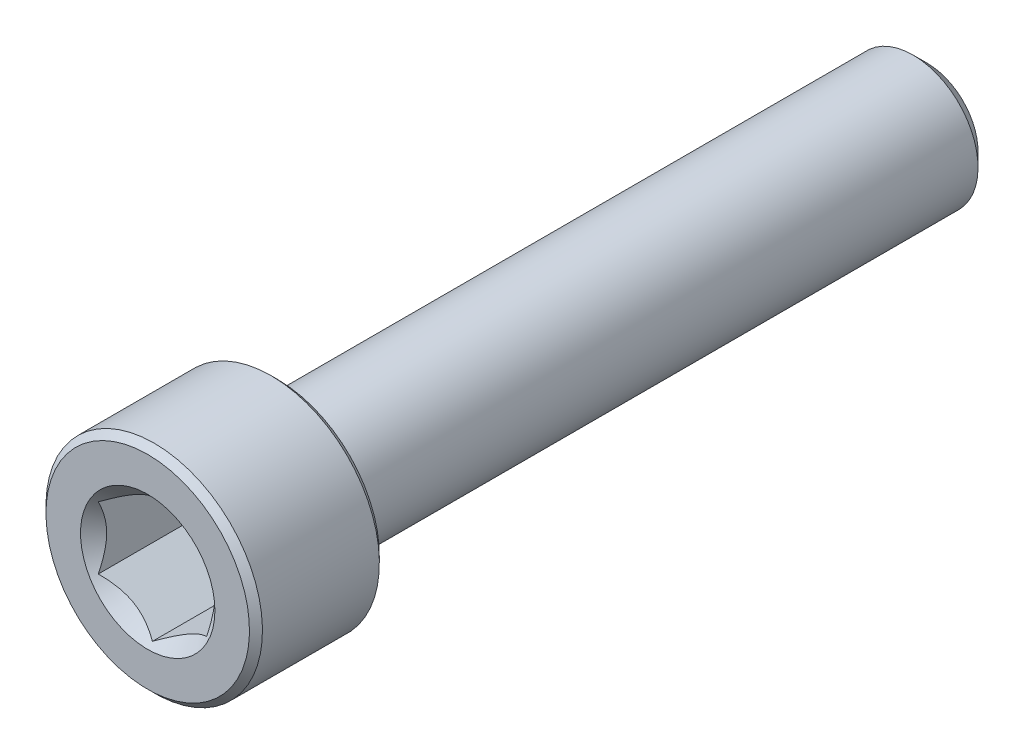
ISO-10303-21;
HEADER;
FILE_DESCRIPTION(('STEP AP214'),'2;1');
FILE_NAME('part.step','',(''),(''),'','','');
FILE_SCHEMA(('AUTOMOTIVE_DESIGN { 1 0 10303 214 1 1 1 1 }'));
ENDSEC;
DATA;
#1=APPLICATION_CONTEXT('core data for automotive mechanical design processes');
#2=APPLICATION_PROTOCOL_DEFINITION('international standard','automotive_design',2000,#1);
#3=PRODUCT_CONTEXT('',#1,'mechanical');
#4=PRODUCT('Part','Part','',(#3));
#5=PRODUCT_RELATED_PRODUCT_CATEGORY('part','',(#4));
#6=PRODUCT_DEFINITION_FORMATION('','',#4);
#7=PRODUCT_DEFINITION_CONTEXT('part definition',#1,'design');
#8=PRODUCT_DEFINITION('design','',#6,#7);
#9=PRODUCT_DEFINITION_SHAPE('','',#8);
#10=(LENGTH_UNIT() NAMED_UNIT(*) SI_UNIT(.MILLI.,.METRE.));
#11=(NAMED_UNIT(*) PLANE_ANGLE_UNIT() SI_UNIT($,.RADIAN.));
#12=(NAMED_UNIT(*) SI_UNIT($,.STERADIAN.) SOLID_ANGLE_UNIT());
#13=UNCERTAINTY_MEASURE_WITH_UNIT(LENGTH_MEASURE(1.E-05),#10,'distance_accuracy_value','');
#14=(GEOMETRIC_REPRESENTATION_CONTEXT(3) GLOBAL_UNCERTAINTY_ASSIGNED_CONTEXT((#13)) GLOBAL_UNIT_ASSIGNED_CONTEXT((#10,
#11,#12)) REPRESENTATION_CONTEXT('',''));
#15=CARTESIAN_POINT('',(0.,0.,0.));
#16=DIRECTION('',(0.,0.,1.));
#17=DIRECTION('',(1.,0.,0.));
#18=AXIS2_PLACEMENT_3D('',#15,#16,#17);
#19=CARTESIAN_POINT('',(0.,2.35048094716167,-18.));
#20=DIRECTION('',(0.,0.,-1.));
#21=DIRECTION('',(0.,1.,0.));
#22=AXIS2_PLACEMENT_3D('',#19,#20,#21);
#23=PLANE('',#22);
#24=CARTESIAN_POINT('',(0.,0.,-18.));
#25=DIRECTION('',(0.,0.,-1.));
#26=DIRECTION('',(0.,1.,0.));
#27=AXIS2_PLACEMENT_3D('',#24,#25,#26);
#28=CIRCLE('',#27,2.35048094716167);
#29=CARTESIAN_POINT('',(0.,2.35048094716167,-18.));
#30=VERTEX_POINT('',#29);
#31=EDGE_CURVE('E56',#30,#30,#28,.T.);
#32=ORIENTED_EDGE('',*,*,#31,.T.);
#33=EDGE_LOOP('',(#32));
#34=FACE_BOUND('',#33,.T.);
#35=ADVANCED_FACE('F43',(#34),#23,.T.);
#36=CARTESIAN_POINT('',(0.,0.,-18.));
#37=DIRECTION('',(0.,0.,1.));
#38=DIRECTION('',(0.,-1.,0.));
#39=AXIS2_PLACEMENT_3D('',#36,#37,#38);
#40=CONICAL_SURFACE('',#39,2.35048094716167,0.785398163397446);
#41=CARTESIAN_POINT('',(0.,0.,-17.3504809471617));
#42=DIRECTION('',(0.,0.,-1.));
#43=DIRECTION('',(0.,1.,0.));
#44=AXIS2_PLACEMENT_3D('',#41,#42,#43);
#45=CIRCLE('',#44,3.);
#46=CARTESIAN_POINT('',(0.,3.,-17.3504809471617));
#47=VERTEX_POINT('',#46);
#48=EDGE_CURVE('E159',#47,#47,#45,.T.);
#49=ORIENTED_EDGE('',*,*,#48,.T.);
#50=EDGE_LOOP('',(#49));
#51=FACE_BOUND('',#50,.T.);
#52=ORIENTED_EDGE('',*,*,#31,.F.);
#53=EDGE_LOOP('',(#52));
#54=FACE_BOUND('',#53,.T.);
#55=ADVANCED_FACE('F165',(#51,#54),#40,.T.);
#56=CARTESIAN_POINT('',(0.,0.,-18.));
#57=DIRECTION('',(0.,0.,-1.));
#58=DIRECTION('',(0.,1.,0.));
#59=AXIS2_PLACEMENT_3D('',#56,#57,#58);
#60=CYLINDRICAL_SURFACE('',#59,3.);
#61=CARTESIAN_POINT('',(0.,0.,11.7));
#62=DIRECTION('',(0.,0.,-1.));
#63=DIRECTION('',(0.,1.,0.));
#64=AXIS2_PLACEMENT_3D('',#61,#62,#63);
#65=CIRCLE('',#64,3.);
#66=CARTESIAN_POINT('',(0.,3.,11.7));
#67=VERTEX_POINT('',#66);
#68=EDGE_CURVE('E156',#67,#67,#65,.T.);
#69=ORIENTED_EDGE('',*,*,#68,.T.);
#70=EDGE_LOOP('',(#69));
#71=FACE_BOUND('',#70,.T.);
#72=ORIENTED_EDGE('',*,*,#48,.F.);
#73=EDGE_LOOP('',(#72));
#74=FACE_BOUND('',#73,.T.);
#75=ADVANCED_FACE('F167',(#71,#74),#60,.T.);
#76=CARTESIAN_POINT('',(0.,0.,11.7));
#77=DIRECTION('',(0.,0.,-1.));
#78=DIRECTION('',(0.,1.,0.));
#79=AXIS2_PLACEMENT_3D('',#76,#77,#78);
#80=TOROIDAL_SURFACE('',#79,3.3,0.3);
#81=CARTESIAN_POINT('',(0.,0.,12.));
#82=DIRECTION('',(0.,0.,-1.));
#83=DIRECTION('',(0.,1.,0.));
#84=AXIS2_PLACEMENT_3D('',#81,#82,#83);
#85=CIRCLE('',#84,3.3);
#86=CARTESIAN_POINT('',(0.,3.3,12.));
#87=VERTEX_POINT('',#86);
#88=EDGE_CURVE('E153',#87,#87,#85,.T.);
#89=ORIENTED_EDGE('',*,*,#88,.T.);
#90=EDGE_LOOP('',(#89));
#91=FACE_BOUND('',#90,.T.);
#92=ORIENTED_EDGE('',*,*,#68,.F.);
#93=EDGE_LOOP('',(#92));
#94=FACE_BOUND('',#93,.T.);
#95=ADVANCED_FACE('F173',(#91,#94),#80,.F.);
#96=CARTESIAN_POINT('',(0.,4.7,12.));
#97=DIRECTION('',(0.,0.,-1.));
#98=DIRECTION('',(0.,1.,0.));
#99=AXIS2_PLACEMENT_3D('',#96,#97,#98);
#100=PLANE('',#99);
#101=CARTESIAN_POINT('',(0.,0.,12.));
#102=DIRECTION('',(0.,0.,-1.));
#103=DIRECTION('',(0.,1.,0.));
#104=AXIS2_PLACEMENT_3D('',#101,#102,#103);
#105=CIRCLE('',#104,4.7);
#106=CARTESIAN_POINT('',(0.,4.7,12.));
#107=VERTEX_POINT('',#106);
#108=EDGE_CURVE('E150',#107,#107,#105,.T.);
#109=ORIENTED_EDGE('',*,*,#108,.T.);
#110=EDGE_LOOP('',(#109));
#111=FACE_BOUND('',#110,.T.);
#112=ORIENTED_EDGE('',*,*,#88,.F.);
#113=EDGE_LOOP('',(#112));
#114=FACE_BOUND('',#113,.T.);
#115=ADVANCED_FACE('F179',(#111,#114),#100,.T.);
#116=CARTESIAN_POINT('',(0.,0.,12.));
#117=DIRECTION('',(0.,0.,1.));
#118=DIRECTION('',(0.,-1.,0.));
#119=AXIS2_PLACEMENT_3D('',#116,#117,#118);
#120=CONICAL_SURFACE('',#119,4.7,0.785398163397445);
#121=CARTESIAN_POINT('',(0.,0.,12.3));
#122=DIRECTION('',(0.,0.,-1.));
#123=DIRECTION('',(0.,1.,0.));
#124=AXIS2_PLACEMENT_3D('',#121,#122,#123);
#125=CIRCLE('',#124,5.);
#126=CARTESIAN_POINT('',(0.,5.,12.3));
#127=VERTEX_POINT('',#126);
#128=EDGE_CURVE('E147',#127,#127,#125,.T.);
#129=ORIENTED_EDGE('',*,*,#128,.T.);
#130=EDGE_LOOP('',(#129));
#131=FACE_BOUND('',#130,.T.);
#132=ORIENTED_EDGE('',*,*,#108,.F.);
#133=EDGE_LOOP('',(#132));
#134=FACE_BOUND('',#133,.T.);
#135=ADVANCED_FACE('F183',(#131,#134),#120,.T.);
#136=CARTESIAN_POINT('',(0.,0.,-18.));
#137=DIRECTION('',(0.,0.,-1.));
#138=DIRECTION('',(0.,1.,0.));
#139=AXIS2_PLACEMENT_3D('',#136,#137,#138);
#140=CYLINDRICAL_SURFACE('',#139,5.);
#141=CARTESIAN_POINT('',(0.,0.,17.7));
#142=DIRECTION('',(0.,0.,-1.));
#143=DIRECTION('',(0.,1.,0.));
#144=AXIS2_PLACEMENT_3D('',#141,#142,#143);
#145=CIRCLE('',#144,5.);
#146=CARTESIAN_POINT('',(0.,5.,17.7));
#147=VERTEX_POINT('',#146);
#148=EDGE_CURVE('E144',#147,#147,#145,.T.);
#149=ORIENTED_EDGE('',*,*,#148,.T.);
#150=EDGE_LOOP('',(#149));
#151=FACE_BOUND('',#150,.T.);
#152=ORIENTED_EDGE('',*,*,#128,.F.);
#153=EDGE_LOOP('',(#152));
#154=FACE_BOUND('',#153,.T.);
#155=ADVANCED_FACE('F187',(#151,#154),#140,.T.);
#156=CARTESIAN_POINT('',(0.,0.,17.7));
#157=DIRECTION('',(0.,0.,-1.));
#158=DIRECTION('',(0.,1.,0.));
#159=AXIS2_PLACEMENT_3D('',#156,#157,#158);
#160=CONICAL_SURFACE('',#159,5.,0.785398163397445);
#161=CARTESIAN_POINT('',(0.,0.,18.));
#162=DIRECTION('',(0.,0.,-1.));
#163=DIRECTION('',(0.,1.,0.));
#164=AXIS2_PLACEMENT_3D('',#161,#162,#163);
#165=CIRCLE('',#164,4.7);
#166=CARTESIAN_POINT('',(0.,4.7,18.));
#167=VERTEX_POINT('',#166);
#168=EDGE_CURVE('E141',#167,#167,#165,.T.);
#169=ORIENTED_EDGE('',*,*,#168,.T.);
#170=EDGE_LOOP('',(#169));
#171=FACE_BOUND('',#170,.T.);
#172=ORIENTED_EDGE('',*,*,#148,.F.);
#173=EDGE_LOOP('',(#172));
#174=FACE_BOUND('',#173,.T.);
#175=ADVANCED_FACE('F191',(#171,#174),#160,.T.);
#176=CARTESIAN_POINT('',(0.,0.,18.));
#177=DIRECTION('',(0.,0.,1.));
#178=DIRECTION('',(0.,-1.,0.));
#179=AXIS2_PLACEMENT_3D('',#176,#177,#178);
#180=PLANE('',#179);
#181=CARTESIAN_POINT('',(0.,0.,18.));
#182=DIRECTION('',(0.,0.,1.));
#183=DIRECTION('',(1.,0.,0.));
#184=AXIS2_PLACEMENT_3D('',#181,#182,#183);
#185=CIRCLE('',#184,3.10325769689424);
#186=CARTESIAN_POINT('',(3.10325769689424,0.,18.));
#187=VERTEX_POINT('',#186);
#188=EDGE_CURVE('E115',#187,#187,#185,.T.);
#189=ORIENTED_EDGE('',*,*,#188,.F.);
#190=EDGE_LOOP('',(#189));
#191=FACE_BOUND('',#190,.T.);
#192=ORIENTED_EDGE('',*,*,#168,.F.);
#193=EDGE_LOOP('',(#192));
#194=FACE_BOUND('',#193,.T.);
#195=ADVANCED_FACE('F195',(#191,#194),#180,.T.);
#196=CARTESIAN_POINT('',(0.,0.,18.));
#197=DIRECTION('',(0.,0.,1.));
#198=DIRECTION('',(1.,0.,0.));
#199=AXIS2_PLACEMENT_3D('',#196,#197,#198);
#200=CONICAL_SURFACE('',#199,3.10325769689424,0.78539816339745);
#201=ORIENTED_EDGE('',*,*,#188,.T.);
#202=EDGE_LOOP('',(#201));
#203=FACE_BOUND('',#202,.T.);
#204=CARTESIAN_POINT('',(-0.000199999999999129,-2.88686681600197,17.7836091260357));
#205=CARTESIAN_POINT('',(0.0857382777877653,-2.83725032818751,17.7340343544086));
#206=CARTESIAN_POINT('',(0.173113567275753,-2.7868041812811,17.6873711304164));
#207=CARTESIAN_POINT('',(0.351281456165589,-2.6839389026696,17.6019317890922));
#208=CARTESIAN_POINT('',(0.442091000681075,-2.6315099876986,17.5632032114599));
#209=CARTESIAN_POINT('',(0.625204123126922,-2.52578957716234,17.4968603529516));
#210=CARTESIAN_POINT('',(0.717461064529341,-2.47252500720904,17.4690793175848));
#211=CARTESIAN_POINT('',(0.904006008776287,-2.3648232334321,17.4262768249646));
#212=CARTESIAN_POINT('',(0.998288312566284,-2.31038931995913,17.4112234157252));
#213=CARTESIAN_POINT('',(1.16077825829185,-2.21657570605387,17.3976413712634));
#214=CARTESIAN_POINT('',(1.22877596788015,-2.17731721011878,17.3956307482947));
#215=CARTESIAN_POINT('',(1.36466024116922,-2.0988643883567,17.3990177662414));
#216=CARTESIAN_POINT('',(1.43254675755224,-2.05967008984862,17.4044180043537));
#217=CARTESIAN_POINT('',(1.56767878823611,-1.98165157555715,17.4223194374564));
#218=CARTESIAN_POINT('',(1.63492349975356,-1.94282782326097,17.4348285761004));
#219=CARTESIAN_POINT('',(1.7682501008182,-1.86585167424616,17.4662611510096));
#220=CARTESIAN_POINT('',(1.83433207909966,-1.82769922629678,17.4851840955507));
#221=CARTESIAN_POINT('',(2.00359634669126,-1.72997445583858,17.5413610104621));
#222=CARTESIAN_POINT('',(2.10572912222289,-1.67100807039231,17.5828494806501));
#223=CARTESIAN_POINT('',(2.25590641494051,-1.58430317001562,17.652887695777));
#224=CARTESIAN_POINT('',(2.30539653988261,-1.55573003305807,17.67749590117));
#225=CARTESIAN_POINT('',(2.40346006383885,-1.49911303110426,17.7289555357691));
#226=CARTESIAN_POINT('',(2.45203400349693,-1.47106885396706,17.7558055878332));
#227=CARTESIAN_POINT('',(2.5002,-1.44326020292023,17.7836091260357));
#228=B_SPLINE_CURVE_WITH_KNOTS('',3,(#204,#205,#206,#207,#208,#209,#210,#211,#212,#213,#214,
#215,#216,#217,#218,#219,#220,#221,#222,#223,#224,#225,#226,#227),.UNSPECIFIED.,.F.,.F.,(4,2,2,
2,2,2,2,2,2,2,2,4),(0.,0.333012085133924,0.667964518301398,0.9975970320433,1.32639954393844,
1.56169424147169,1.79707142102083,2.03271213522171,2.26833478775651,2.64260240809533,
2.82922877818864,3.01574133749025),.UNSPECIFIED.);
#229=CARTESIAN_POINT('',(0.,-2.88675134594813,17.7834936490539));
#230=VERTEX_POINT('',#229);
#231=CARTESIAN_POINT('',(2.5,-1.44337567297406,17.7834936490539));
#232=VERTEX_POINT('',#231);
#233=EDGE_CURVE('E12',#230,#232,#228,.T.);
#234=ORIENTED_EDGE('',*,*,#233,.F.);
#235=CARTESIAN_POINT('',(-2.5002,-1.44326020292023,17.7836091260357));
#236=CARTESIAN_POINT('',(-2.41426172221224,-1.49287669073469,17.7340343544086));
#237=CARTESIAN_POINT('',(-2.32688643272425,-1.5433228376411,17.6873711304164));
#238=CARTESIAN_POINT('',(-2.14871854383441,-1.64618811625259,17.6019317890922));
#239=CARTESIAN_POINT('',(-2.05790899931893,-1.69861703122359,17.5632032114599));
#240=CARTESIAN_POINT('',(-1.87479587687308,-1.80433744175986,17.4968603529516));
#241=CARTESIAN_POINT('',(-1.78253893547066,-1.85760201171316,17.4690793175848));
#242=CARTESIAN_POINT('',(-1.59599399122371,-1.96530378549009,17.4262768249646));
#243=CARTESIAN_POINT('',(-1.50171168743372,-2.01973769896307,17.4112234157252));
#244=CARTESIAN_POINT('',(-1.33922174170816,-2.11355131286833,17.3976413712634));
#245=CARTESIAN_POINT('',(-1.27122403211985,-2.15280980880341,17.3956307482947));
#246=CARTESIAN_POINT('',(-1.13533975883078,-2.23126263056549,17.3990177662414));
#247=CARTESIAN_POINT('',(-1.06745324244776,-2.27045692907358,17.4044180043537));
#248=CARTESIAN_POINT('',(-0.932321211763895,-2.34847544336505,17.4223194374564));
#249=CARTESIAN_POINT('',(-0.865076500246441,-2.38729919566123,17.4348285761004));
#250=CARTESIAN_POINT('',(-0.731749899181802,-2.46427534467604,17.4662611510096));
#251=CARTESIAN_POINT('',(-0.665667920900344,-2.50242779262542,17.4851840955507));
#252=CARTESIAN_POINT('',(-0.496403653308737,-2.60015256308362,17.5413610104621));
#253=CARTESIAN_POINT('',(-0.394270877777109,-2.65911894852989,17.5828494806501));
#254=CARTESIAN_POINT('',(-0.244093585059493,-2.74582384890657,17.652887695777));
#255=CARTESIAN_POINT('',(-0.194603460117392,-2.77439698586412,17.67749590117));
#256=CARTESIAN_POINT('',(-0.0965399361611526,-2.83101398781794,17.7289555357691));
#257=CARTESIAN_POINT('',(-0.0479659965030708,-2.85905816495513,17.7558055878333));
#258=CARTESIAN_POINT('',(0.000200000000001979,-2.88686681600197,17.7836091260357));
#259=B_SPLINE_CURVE_WITH_KNOTS('',3,(#235,#236,#237,#238,#239,#240,#241,#242,#243,#244,#245,
#246,#247,#248,#249,#250,#251,#252,#253,#254,#255,#256,#257,#258),.UNSPECIFIED.,.F.,.F.,(4,2,2,
2,2,2,2,2,2,2,2,4),(0.,0.333012085133922,0.667964518301396,0.997597032043298,1.32639954393844,
1.56169424147168,1.79707142102083,2.03271213522171,2.2683347877565,2.64260240809533,
2.82922877818864,3.01574133749025),.UNSPECIFIED.);
#260=CARTESIAN_POINT('',(-2.5,-1.44337567297407,17.7834936490539));
#261=VERTEX_POINT('',#260);
#262=EDGE_CURVE('E101',#261,#230,#259,.T.);
#263=ORIENTED_EDGE('',*,*,#262,.F.);
#264=CARTESIAN_POINT('',(-2.5,-3.0404429247869,18.8330214063817));
#265=CARTESIAN_POINT('',(-2.5,-2.96709478172557,18.7763788487171));
#266=CARTESIAN_POINT('',(-2.5,-2.89335465135762,18.7202359693275));
#267=CARTESIAN_POINT('',(-2.5,-2.74492905640712,18.6091787819783));
#268=CARTESIAN_POINT('',(-2.5,-2.67024337493575,18.5542647641906));
#269=CARTESIAN_POINT('',(-2.5,-2.51921990828824,18.4455038420407));
#270=CARTESIAN_POINT('',(-2.5,-2.44287382770906,18.391668419147));
#271=CARTESIAN_POINT('',(-2.5,-2.28891665120372,18.2858441602624));
#272=CARTESIAN_POINT('',(-2.5,-2.21130564250585,18.2338551977208));
#273=CARTESIAN_POINT('',(-2.5,-2.04951799142745,18.1288457042913));
#274=CARTESIAN_POINT('',(-2.5,-1.96524215656549,18.0759772332794));
#275=CARTESIAN_POINT('',(-2.5,-1.79473490703969,17.9734987026906));
#276=CARTESIAN_POINT('',(-2.5,-1.70850374831488,17.9238882199388));
#277=CARTESIAN_POINT('',(-2.5,-1.53401833929875,17.8289545270337));
#278=CARTESIAN_POINT('',(-2.5,-1.44577065756376,17.7836193384592));
#279=CARTESIAN_POINT('',(-2.5,-1.26676310994809,17.6982604224777));
#280=CARTESIAN_POINT('',(-2.5,-1.17600446376454,17.658234169168));
#281=CARTESIAN_POINT('',(-2.5,-1.00118351570532,17.5886962875671));
#282=CARTESIAN_POINT('',(-2.5,-0.917385051629539,17.5585280842829));
#283=CARTESIAN_POINT('',(-2.5,-0.747629060099934,17.5048969377877));
#284=CARTESIAN_POINT('',(-2.5,-0.661671397551608,17.4814344152734));
#285=CARTESIAN_POINT('',(-2.5,-0.48962208120087,17.4428857605003));
#286=CARTESIAN_POINT('',(-2.5,-0.403565521298252,17.4276456482725));
#287=CARTESIAN_POINT('',(-2.5,-0.23035238962982,17.4058639492467));
#288=CARTESIAN_POINT('',(-2.5,-0.143196059113863,17.3993204870893));
#289=CARTESIAN_POINT('',(-2.5,0.027361229544661,17.395504167584));
#290=CARTESIAN_POINT('',(-2.5,0.110753131974795,17.3978241071313));
#291=CARTESIAN_POINT('',(-2.5,0.276898134935752,17.4106653349727));
#292=CARTESIAN_POINT('',(-2.5,0.359651177707741,17.421187356241));
#293=CARTESIAN_POINT('',(-2.5,0.52532592779518,17.4500114990314));
#294=CARTESIAN_POINT('',(-2.5,0.608223175291062,17.4684520406654));
#295=CARTESIAN_POINT('',(-2.5,0.772178834557463,17.5120846864152));
#296=CARTESIAN_POINT('',(-2.5,0.853237339741923,17.5372764467107));
#297=CARTESIAN_POINT('',(-2.5,1.10159689599554,17.6241193926927));
#298=CARTESIAN_POINT('',(-2.5,1.2655525401235,17.6953668377804));
#299=CARTESIAN_POINT('',(-2.5,1.50551769780195,17.8142345481021));
#300=CARTESIAN_POINT('',(-2.5,1.58465788064154,17.8559484521643));
#301=CARTESIAN_POINT('',(-2.5,1.74114816885993,17.9426161601922));
#302=CARTESIAN_POINT('',(-2.5,1.81849858456147,17.9875693968529));
#303=CARTESIAN_POINT('',(-2.5,1.96784059769267,18.0777853522682));
#304=CARTESIAN_POINT('',(-2.5,2.03990833441822,18.1229234485208));
#305=CARTESIAN_POINT('',(-2.5,2.18280709640722,18.2151257428437));
#306=CARTESIAN_POINT('',(-2.5,2.25363802857339,18.2621900850232));
#307=CARTESIAN_POINT('',(-2.5,2.39365462675841,18.3575181428367));
#308=CARTESIAN_POINT('',(-2.5,2.46284892785042,18.405769227967));
#309=CARTESIAN_POINT('',(-2.5,2.60028772768958,18.5035675953205));
#310=CARTESIAN_POINT('',(-2.5,2.66853248306037,18.5531145164816));
#311=CARTESIAN_POINT('',(-2.5,2.73637900498552,18.6031920948776));
#312=B_SPLINE_CURVE_WITH_KNOTS('',3,(#264,#265,#266,#267,#268,#269,#270,#271,#272,#273,#274,
#275,#276,#277,#278,#279,#280,#281,#282,#283,#284,#285,#286,#287,#288,#289,#290,#291,#292,#293,
#294,#295,#296,#297,#298,#299,#300,#301,#302,#303,#304,#305,#306,#307,#308,#309,#310,#311),
.UNSPECIFIED.,.F.,.F.,(4,2,2,2,2,2,2,2,2,2,2,2,2,2,2,2,2,2,2,2,2,2,2,4),(0.,0.278024739230087,
0.556114450273836,0.836346737531474,1.11655978131475,1.41496015304213,1.71332168905072,
2.01082076966666,2.30817779353377,2.57513879386764,2.84211653895115,3.10390388797607,
3.36563477559628,3.61548897009284,3.86536549522731,4.11980016461986,4.37422187884309,
4.90887010890445,5.17722912654036,5.44554126009378,5.70061957252692,5.95571700326383,
6.20877059828287,6.46175442014512),.UNSPECIFIED.);
#313=CARTESIAN_POINT('',(-2.5,1.44337567297406,17.7834936490539));
#314=VERTEX_POINT('',#313);
#315=EDGE_CURVE('E114',#314,#261,#312,.F.);
#316=ORIENTED_EDGE('',*,*,#315,.F.);
#317=CARTESIAN_POINT('',(0.000199999999999144,2.88686681600197,17.7836091260357));
#318=CARTESIAN_POINT('',(-0.0857382777877659,2.83725032818751,17.7340343544086));
#319=CARTESIAN_POINT('',(-0.173113567275754,2.7868041812811,17.6873711304164));
#320=CARTESIAN_POINT('',(-0.35128145616559,2.6839389026696,17.6019317890922));
#321=CARTESIAN_POINT('',(-0.442091000681075,2.6315099876986,17.5632032114599));
#322=CARTESIAN_POINT('',(-0.625204123126921,2.52578957716234,17.4968603529516));
#323=CARTESIAN_POINT('',(-0.71746106452934,2.47252500720904,17.4690793175848));
#324=CARTESIAN_POINT('',(-0.904006008776286,2.3648232334321,17.4262768249646));
#325=CARTESIAN_POINT('',(-0.998288312566284,2.31038931995913,17.4112234157252));
#326=CARTESIAN_POINT('',(-1.16077825829185,2.21657570605387,17.3976413712634));
#327=CARTESIAN_POINT('',(-1.22877596788015,2.17731721011878,17.3956307482947));
#328=CARTESIAN_POINT('',(-1.36466024116922,2.0988643883567,17.3990177662414));
#329=CARTESIAN_POINT('',(-1.43254675755224,2.05967008984862,17.4044180043537));
#330=CARTESIAN_POINT('',(-1.56767878823611,1.98165157555715,17.4223194374564));
#331=CARTESIAN_POINT('',(-1.63492349975356,1.94282782326096,17.4348285761004));
#332=CARTESIAN_POINT('',(-1.7682501008182,1.86585167424616,17.4662611510096));
#333=CARTESIAN_POINT('',(-1.83433207909966,1.82769922629677,17.4851840955507));
#334=CARTESIAN_POINT('',(-2.00359634669126,1.72997445583858,17.5413610104621));
#335=CARTESIAN_POINT('',(-2.10572912222289,1.67100807039231,17.5828494806501));
#336=CARTESIAN_POINT('',(-2.25590641494051,1.58430317001562,17.652887695777));
#337=CARTESIAN_POINT('',(-2.30539653988261,1.55573003305807,17.67749590117));
#338=CARTESIAN_POINT('',(-2.40346006383885,1.49911303110425,17.7289555357691));
#339=CARTESIAN_POINT('',(-2.45203400349693,1.47106885396706,17.7558055878332));
#340=CARTESIAN_POINT('',(-2.5002,1.44326020292023,17.7836091260357));
#341=B_SPLINE_CURVE_WITH_KNOTS('',3,(#317,#318,#319,#320,#321,#322,#323,#324,#325,#326,#327,
#328,#329,#330,#331,#332,#333,#334,#335,#336,#337,#338,#339,#340),.UNSPECIFIED.,.F.,.F.,(4,2,2,
2,2,2,2,2,2,2,2,4),(0.,0.333012085133924,0.667964518301396,0.997597032043298,1.32639954393844,
1.56169424147169,1.79707142102083,2.03271213522171,2.26833478775651,2.64260240809533,
2.82922877818863,3.01574133749025),.UNSPECIFIED.);
#342=CARTESIAN_POINT('',(0.,2.88675134594813,17.7834936490539));
#343=VERTEX_POINT('',#342);
#344=EDGE_CURVE('E245',#343,#314,#341,.T.);
#345=ORIENTED_EDGE('',*,*,#344,.F.);
#346=CARTESIAN_POINT('',(2.5002,1.44326020292023,17.7836091260357));
#347=CARTESIAN_POINT('',(2.41426172221224,1.49287669073469,17.7340343544086));
#348=CARTESIAN_POINT('',(2.32688643272425,1.5433228376411,17.6873711304164));
#349=CARTESIAN_POINT('',(2.14871854383441,1.64618811625259,17.6019317890922));
#350=CARTESIAN_POINT('',(2.05790899931893,1.69861703122359,17.5632032114599));
#351=CARTESIAN_POINT('',(1.87479587687308,1.80433744175986,17.4968603529516));
#352=CARTESIAN_POINT('',(1.78253893547066,1.85760201171315,17.4690793175848));
#353=CARTESIAN_POINT('',(1.59599399122371,1.96530378549009,17.4262768249646));
#354=CARTESIAN_POINT('',(1.50171168743372,2.01973769896307,17.4112234157252));
#355=CARTESIAN_POINT('',(1.33922174170815,2.11355131286833,17.3976413712634));
#356=CARTESIAN_POINT('',(1.27122403211985,2.15280980880341,17.3956307482947));
#357=CARTESIAN_POINT('',(1.13533975883078,2.23126263056549,17.3990177662414));
#358=CARTESIAN_POINT('',(1.06745324244776,2.27045692907357,17.4044180043537));
#359=CARTESIAN_POINT('',(0.932321211763894,2.34847544336505,17.4223194374564));
#360=CARTESIAN_POINT('',(0.865076500246439,2.38729919566123,17.4348285761004));
#361=CARTESIAN_POINT('',(0.7317498991818,2.46427534467603,17.4662611510096));
#362=CARTESIAN_POINT('',(0.665667920900342,2.50242779262542,17.4851840955507));
#363=CARTESIAN_POINT('',(0.496403653308735,2.60015256308362,17.5413610104621));
#364=CARTESIAN_POINT('',(0.394270877777107,2.65911894852989,17.5828494806501));
#365=CARTESIAN_POINT('',(0.244093585059491,2.74582384890657,17.652887695777));
#366=CARTESIAN_POINT('',(0.194603460117391,2.77439698586412,17.67749590117));
#367=CARTESIAN_POINT('',(0.0965399361611528,2.83101398781794,17.7289555357691));
#368=CARTESIAN_POINT('',(0.0479659965030715,2.85905816495513,17.7558055878332));
#369=CARTESIAN_POINT('',(-0.00020000000000044,2.88686681600197,17.7836091260357));
#370=B_SPLINE_CURVE_WITH_KNOTS('',3,(#346,#347,#348,#349,#350,#351,#352,#353,#354,#355,#356,
#357,#358,#359,#360,#361,#362,#363,#364,#365,#366,#367,#368,#369),.UNSPECIFIED.,.F.,.F.,(4,2,2,
2,2,2,2,2,2,2,2,4),(0.,0.333012085133924,0.667964518301396,0.997597032043299,1.32639954393844,
1.56169424147169,1.79707142102083,2.03271213522171,2.26833478775651,2.64260240809533,
2.82922877818864,3.01574133749025),.UNSPECIFIED.);
#371=CARTESIAN_POINT('',(2.5,1.44337567297406,17.7834936490539));
#372=VERTEX_POINT('',#371);
#373=EDGE_CURVE('E218',#372,#343,#370,.T.);
#374=ORIENTED_EDGE('',*,*,#373,.F.);
#375=CARTESIAN_POINT('',(2.5,-3.0404429247869,18.8330214063817));
#376=CARTESIAN_POINT('',(2.5,-2.96709478172557,18.7763788487171));
#377=CARTESIAN_POINT('',(2.5,-2.89335465135762,18.7202359693275));
#378=CARTESIAN_POINT('',(2.5,-2.74492905640712,18.6091787819783));
#379=CARTESIAN_POINT('',(2.5,-2.67024337493575,18.5542647641906));
#380=CARTESIAN_POINT('',(2.5,-2.51921990828824,18.4455038420407));
#381=CARTESIAN_POINT('',(2.5,-2.44287382770906,18.391668419147));
#382=CARTESIAN_POINT('',(2.5,-2.28891665120372,18.2858441602624));
#383=CARTESIAN_POINT('',(2.5,-2.21130564250584,18.2338551977208));
#384=CARTESIAN_POINT('',(2.5,-2.04951799142744,18.1288457042913));
#385=CARTESIAN_POINT('',(2.5,-1.96524215656549,18.0759772332794));
#386=CARTESIAN_POINT('',(2.5,-1.79473490703968,17.9734987026906));
#387=CARTESIAN_POINT('',(2.5,-1.70850374831487,17.9238882199388));
#388=CARTESIAN_POINT('',(2.5,-1.53401833929875,17.8289545270337));
#389=CARTESIAN_POINT('',(2.5,-1.44577065756376,17.7836193384592));
#390=CARTESIAN_POINT('',(2.5,-1.26676310994808,17.6982604224777));
#391=CARTESIAN_POINT('',(2.5,-1.17600446376454,17.658234169168));
#392=CARTESIAN_POINT('',(2.5,-1.00118351570532,17.5886962875671));
#393=CARTESIAN_POINT('',(2.5,-0.917385051629537,17.5585280842829));
#394=CARTESIAN_POINT('',(2.5,-0.747629060099932,17.5048969377877));
#395=CARTESIAN_POINT('',(2.5,-0.661671397551606,17.4814344152734));
#396=CARTESIAN_POINT('',(2.5,-0.489622081200869,17.4428857605003));
#397=CARTESIAN_POINT('',(2.5,-0.403565521298251,17.4276456482725));
#398=CARTESIAN_POINT('',(2.5,-0.230352389629819,17.4058639492467));
#399=CARTESIAN_POINT('',(2.5,-0.143196059113862,17.3993204870893));
#400=CARTESIAN_POINT('',(2.5,0.0273612295446616,17.395504167584));
#401=CARTESIAN_POINT('',(2.5,0.110753131974796,17.3978241071313));
#402=CARTESIAN_POINT('',(2.5,0.276898134935753,17.4106653349727));
#403=CARTESIAN_POINT('',(2.5,0.359651177707741,17.421187356241));
#404=CARTESIAN_POINT('',(2.5,0.525325927795179,17.4500114990314));
#405=CARTESIAN_POINT('',(2.5,0.608223175291062,17.4684520406654));
#406=CARTESIAN_POINT('',(2.5,0.772178834557462,17.5120846864152));
#407=CARTESIAN_POINT('',(2.5,0.853237339741923,17.5372764467107));
#408=CARTESIAN_POINT('',(2.5,1.10159689599554,17.6241193926927));
#409=CARTESIAN_POINT('',(2.5,1.2655525401235,17.6953668377804));
#410=CARTESIAN_POINT('',(2.5,1.50551769780196,17.8142345481021));
#411=CARTESIAN_POINT('',(2.5,1.58465788064155,17.8559484521643));
#412=CARTESIAN_POINT('',(2.5,1.74114816885993,17.9426161601922));
#413=CARTESIAN_POINT('',(2.5,1.81849858456147,17.9875693968529));
#414=CARTESIAN_POINT('',(2.5,1.96784059769267,18.0777853522682));
#415=CARTESIAN_POINT('',(2.5,2.03990833441822,18.1229234485208));
#416=CARTESIAN_POINT('',(2.5,2.18280709640722,18.2151257428437));
#417=CARTESIAN_POINT('',(2.5,2.2536380285734,18.2621900850232));
#418=CARTESIAN_POINT('',(2.5,2.39365462675841,18.3575181428367));
#419=CARTESIAN_POINT('',(2.5,2.46284892785042,18.405769227967));
#420=CARTESIAN_POINT('',(2.5,2.60028772768958,18.5035675953205));
#421=CARTESIAN_POINT('',(2.5,2.66853248306037,18.5531145164816));
#422=CARTESIAN_POINT('',(2.5,2.73637900498552,18.6031920948776));
#423=B_SPLINE_CURVE_WITH_KNOTS('',3,(#375,#376,#377,#378,#379,#380,#381,#382,#383,#384,#385,
#386,#387,#388,#389,#390,#391,#392,#393,#394,#395,#396,#397,#398,#399,#400,#401,#402,#403,#404,
#405,#406,#407,#408,#409,#410,#411,#412,#413,#414,#415,#416,#417,#418,#419,#420,#421,#422),
.UNSPECIFIED.,.F.,.F.,(4,2,2,2,2,2,2,2,2,2,2,2,2,2,2,2,2,2,2,2,2,2,2,4),(0.,0.278024739230089,
0.556114450273835,0.836346737531471,1.11655978131475,1.41496015304214,1.71332168905072,
2.01082076966666,2.30817779353377,2.57513879386763,2.84211653895115,3.10390388797607,
3.36563477559628,3.61548897009283,3.86536549522731,4.11980016461985,4.37422187884308,
4.90887010890445,5.17722912654036,5.44554126009378,5.70061957252692,5.95571700326382,
6.20877059828286,6.46175442014511),.UNSPECIFIED.);
#424=EDGE_CURVE('E63',#232,#372,#423,.T.);
#425=ORIENTED_EDGE('',*,*,#424,.F.);
#426=EDGE_LOOP('',(#234,#263,#316,#345,#374,#425));
#427=FACE_BOUND('',#426,.T.);
#428=ADVANCED_FACE('F100',(#203,#427),#200,.F.);
#429=CARTESIAN_POINT('',(0.,4.7,13.));
#430=DIRECTION('',(0.,0.,-1.));
#431=DIRECTION('',(0.,1.,0.));
#432=AXIS2_PLACEMENT_3D('',#429,#430,#431);
#433=PLANE('',#432);
#434=DIRECTION('',(0.866025403784438,0.5,0.));
#435=VECTOR('',#434,1.);
#436=CARTESIAN_POINT('',(0.,-2.88675134594813,13.));
#437=LINE('',#436,#435);
#438=CARTESIAN_POINT('',(0.,-2.88675134594813,13.));
#439=VERTEX_POINT('',#438);
#440=CARTESIAN_POINT('',(2.5,-1.44337567297406,13.));
#441=VERTEX_POINT('',#440);
#442=EDGE_CURVE('E118',#439,#441,#437,.T.);
#443=ORIENTED_EDGE('',*,*,#442,.T.);
#444=DIRECTION('',(0.,1.,0.));
#445=VECTOR('',#444,1.);
#446=CARTESIAN_POINT('',(2.5,-1.44337567297406,13.));
#447=LINE('',#446,#445);
#448=CARTESIAN_POINT('',(2.5,1.44337567297406,13.));
#449=VERTEX_POINT('',#448);
#450=EDGE_CURVE('E70',#441,#449,#447,.T.);
#451=ORIENTED_EDGE('',*,*,#450,.T.);
#452=DIRECTION('',(-0.866025403784439,0.5,0.));
#453=VECTOR('',#452,1.);
#454=CARTESIAN_POINT('',(2.5,1.44337567297406,13.));
#455=LINE('',#454,#453);
#456=CARTESIAN_POINT('',(0.,2.88675134594813,13.));
#457=VERTEX_POINT('',#456);
#458=EDGE_CURVE('E126',#449,#457,#455,.T.);
#459=ORIENTED_EDGE('',*,*,#458,.T.);
#460=DIRECTION('',(-0.866025403784438,-0.5,0.));
#461=VECTOR('',#460,1.);
#462=CARTESIAN_POINT('',(0.,2.88675134594813,13.));
#463=LINE('',#462,#461);
#464=CARTESIAN_POINT('',(-2.5,1.44337567297406,13.));
#465=VERTEX_POINT('',#464);
#466=EDGE_CURVE('E133',#457,#465,#463,.T.);
#467=ORIENTED_EDGE('',*,*,#466,.T.);
#468=DIRECTION('',(0.,-1.,0.));
#469=VECTOR('',#468,1.);
#470=CARTESIAN_POINT('',(-2.5,1.44337567297406,13.));
#471=LINE('',#470,#469);
#472=CARTESIAN_POINT('',(-2.5,-1.44337567297406,13.));
#473=VERTEX_POINT('',#472);
#474=EDGE_CURVE('E129',#465,#473,#471,.T.);
#475=ORIENTED_EDGE('',*,*,#474,.T.);
#476=DIRECTION('',(0.866025403784439,-0.5,0.));
#477=VECTOR('',#476,1.);
#478=CARTESIAN_POINT('',(-2.5,-1.44337567297407,13.));
#479=LINE('',#478,#477);
#480=EDGE_CURVE('E119',#473,#439,#479,.T.);
#481=ORIENTED_EDGE('',*,*,#480,.T.);
#482=EDGE_LOOP('',(#443,#451,#459,#467,#475,#481));
#483=FACE_BOUND('',#482,.T.);
#484=ADVANCED_FACE('F200',(#483),#433,.F.);
#485=CARTESIAN_POINT('',(0.,-2.88675134594813,4.36237384174027));
#486=DIRECTION('',(0.5,-0.866025403784438,0.));
#487=DIRECTION('',(0.866025403784438,0.5,0.));
#488=AXIS2_PLACEMENT_3D('',#485,#486,#487);
#489=PLANE('',#488);
#490=DIRECTION('',(0.,0.,1.));
#491=VECTOR('',#490,1.);
#492=CARTESIAN_POINT('',(0.,-2.88675134594813,4.36237384174027));
#493=LINE('',#492,#491);
#494=EDGE_CURVE('E110',#439,#230,#493,.T.);
#495=ORIENTED_EDGE('',*,*,#494,.T.);
#496=ORIENTED_EDGE('',*,*,#233,.T.);
#497=DIRECTION('',(0.,0.,1.));
#498=VECTOR('',#497,1.);
#499=CARTESIAN_POINT('',(2.5,-1.44337567297406,4.36237384174027));
#500=LINE('',#499,#498);
#501=EDGE_CURVE('E121',#441,#232,#500,.T.);
#502=ORIENTED_EDGE('',*,*,#501,.F.);
#503=ORIENTED_EDGE('',*,*,#442,.F.);
#504=EDGE_LOOP('',(#495,#496,#502,#503));
#505=FACE_BOUND('',#504,.T.);
#506=ADVANCED_FACE('F117',(#505),#489,.F.);
#507=CARTESIAN_POINT('',(-2.5,-1.44337567297407,4.36237384174027));
#508=DIRECTION('',(-0.5,-0.866025403784439,0.));
#509=DIRECTION('',(0.866025403784439,-0.5,0.));
#510=AXIS2_PLACEMENT_3D('',#507,#508,#509);
#511=PLANE('',#510);
#512=DIRECTION('',(0.,0.,1.));
#513=VECTOR('',#512,1.);
#514=CARTESIAN_POINT('',(-2.5,-1.44337567297407,4.36237384174027));
#515=LINE('',#514,#513);
#516=EDGE_CURVE('E113',#473,#261,#515,.T.);
#517=ORIENTED_EDGE('',*,*,#516,.T.);
#518=ORIENTED_EDGE('',*,*,#262,.T.);
#519=ORIENTED_EDGE('',*,*,#494,.F.);
#520=ORIENTED_EDGE('',*,*,#480,.F.);
#521=EDGE_LOOP('',(#517,#518,#519,#520));
#522=FACE_BOUND('',#521,.T.);
#523=ADVANCED_FACE('F109',(#522),#511,.F.);
#524=CARTESIAN_POINT('',(-2.5,1.44337567297406,4.36237384174027));
#525=DIRECTION('',(-1.,0.,0.));
#526=DIRECTION('',(0.,0.,1.));
#527=AXIS2_PLACEMENT_3D('',#524,#525,#526);
#528=PLANE('',#527);
#529=DIRECTION('',(0.,0.,1.));
#530=VECTOR('',#529,1.);
#531=CARTESIAN_POINT('',(-2.5,1.44337567297406,4.36237384174027));
#532=LINE('',#531,#530);
#533=EDGE_CURVE('E130',#465,#314,#532,.T.);
#534=ORIENTED_EDGE('',*,*,#533,.T.);
#535=ORIENTED_EDGE('',*,*,#315,.T.);
#536=ORIENTED_EDGE('',*,*,#516,.F.);
#537=ORIENTED_EDGE('',*,*,#474,.F.);
#538=EDGE_LOOP('',(#534,#535,#536,#537));
#539=FACE_BOUND('',#538,.T.);
#540=ADVANCED_FACE('F254',(#539),#528,.F.);
#541=CARTESIAN_POINT('',(0.,2.88675134594813,4.36237384174027));
#542=DIRECTION('',(-0.5,0.866025403784438,0.));
#543=DIRECTION('',(-0.866025403784438,-0.5,0.));
#544=AXIS2_PLACEMENT_3D('',#541,#542,#543);
#545=PLANE('',#544);
#546=DIRECTION('',(0.,0.,1.));
#547=VECTOR('',#546,1.);
#548=CARTESIAN_POINT('',(0.,2.88675134594813,4.36237384174027));
#549=LINE('',#548,#547);
#550=EDGE_CURVE('E134',#457,#343,#549,.T.);
#551=ORIENTED_EDGE('',*,*,#550,.T.);
#552=ORIENTED_EDGE('',*,*,#344,.T.);
#553=ORIENTED_EDGE('',*,*,#533,.F.);
#554=ORIENTED_EDGE('',*,*,#466,.F.);
#555=EDGE_LOOP('',(#551,#552,#553,#554));
#556=FACE_BOUND('',#555,.T.);
#557=ADVANCED_FACE('F251',(#556),#545,.F.);
#558=CARTESIAN_POINT('',(2.5,1.44337567297406,4.36237384174027));
#559=DIRECTION('',(0.5,0.866025403784439,0.));
#560=DIRECTION('',(-0.866025403784439,0.5,0.));
#561=AXIS2_PLACEMENT_3D('',#558,#559,#560);
#562=PLANE('',#561);
#563=DIRECTION('',(0.,0.,1.));
#564=VECTOR('',#563,1.);
#565=CARTESIAN_POINT('',(2.5,1.44337567297406,4.36237384174027));
#566=LINE('',#565,#564);
#567=EDGE_CURVE('E137',#449,#372,#566,.T.);
#568=ORIENTED_EDGE('',*,*,#567,.T.);
#569=ORIENTED_EDGE('',*,*,#373,.T.);
#570=ORIENTED_EDGE('',*,*,#550,.F.);
#571=ORIENTED_EDGE('',*,*,#458,.F.);
#572=EDGE_LOOP('',(#568,#569,#570,#571));
#573=FACE_BOUND('',#572,.T.);
#574=ADVANCED_FACE('F208',(#573),#562,.F.);
#575=CARTESIAN_POINT('',(2.5,-1.44337567297406,4.36237384174027));
#576=DIRECTION('',(1.,0.,0.));
#577=DIRECTION('',(0.,0.,-1.));
#578=AXIS2_PLACEMENT_3D('',#575,#576,#577);
#579=PLANE('',#578);
#580=ORIENTED_EDGE('',*,*,#501,.T.);
#581=ORIENTED_EDGE('',*,*,#424,.T.);
#582=ORIENTED_EDGE('',*,*,#567,.F.);
#583=ORIENTED_EDGE('',*,*,#450,.F.);
#584=EDGE_LOOP('',(#580,#581,#582,#583));
#585=FACE_BOUND('',#584,.T.);
#586=ADVANCED_FACE('F204',(#585),#579,.F.);
#587=CLOSED_SHELL('',(#35,#55,#75,#95,#115,#135,#155,#175,#195,#428,#484,#506,#523,#540,#557,
#574,#586));
#588=MANIFOLD_SOLID_BREP('B2',#587);
#589=ADVANCED_BREP_SHAPE_REPRESENTATION('',(#18,#588),#14);
#590=SHAPE_DEFINITION_REPRESENTATION(#9,#589);
ENDSEC;
END-ISO-10303-21;
